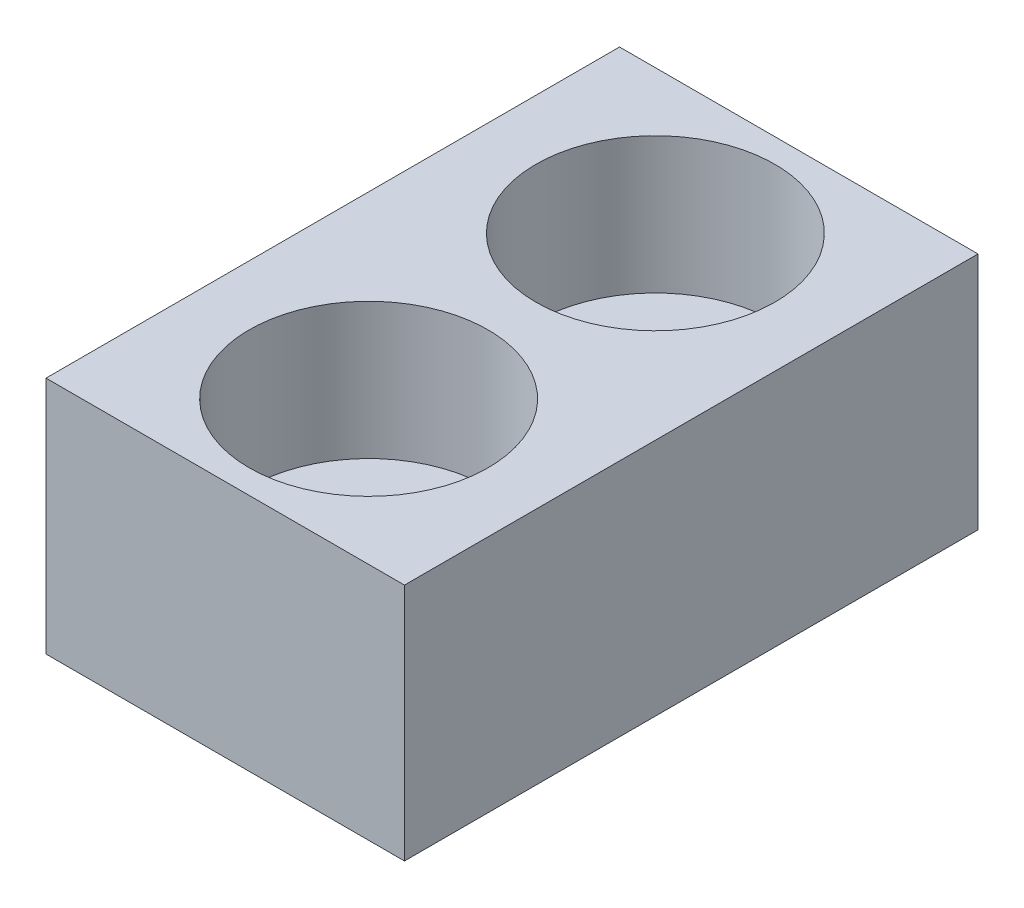
ISO-10303-21;
HEADER;
FILE_DESCRIPTION(('STEP AP214'),'2;1');
FILE_NAME('part.step','',(''),(''),'','','');
FILE_SCHEMA(('AUTOMOTIVE_DESIGN { 1 0 10303 214 1 1 1 1 }'));
ENDSEC;
DATA;
#1=APPLICATION_CONTEXT('core data for automotive mechanical design processes');
#2=APPLICATION_PROTOCOL_DEFINITION('international standard','automotive_design',2000,#1);
#3=PRODUCT_CONTEXT('',#1,'mechanical');
#4=PRODUCT('Part','Part','',(#3));
#5=PRODUCT_RELATED_PRODUCT_CATEGORY('part','',(#4));
#6=PRODUCT_DEFINITION_FORMATION('','',#4);
#7=PRODUCT_DEFINITION_CONTEXT('part definition',#1,'design');
#8=PRODUCT_DEFINITION('design','',#6,#7);
#9=PRODUCT_DEFINITION_SHAPE('','',#8);
#10=(LENGTH_UNIT() NAMED_UNIT(*) SI_UNIT(.MILLI.,.METRE.));
#11=(NAMED_UNIT(*) PLANE_ANGLE_UNIT() SI_UNIT($,.RADIAN.));
#12=(NAMED_UNIT(*) SI_UNIT($,.STERADIAN.) SOLID_ANGLE_UNIT());
#13=UNCERTAINTY_MEASURE_WITH_UNIT(LENGTH_MEASURE(1.E-05),#10,'distance_accuracy_value','');
#14=(GEOMETRIC_REPRESENTATION_CONTEXT(3) GLOBAL_UNCERTAINTY_ASSIGNED_CONTEXT((#13)) GLOBAL_UNIT_ASSIGNED_CONTEXT((#10,
#11,#12)) REPRESENTATION_CONTEXT('',''));
#15=CARTESIAN_POINT('',(0.,0.,0.));
#16=DIRECTION('',(0.,0.,1.));
#17=DIRECTION('',(1.,0.,0.));
#18=AXIS2_PLACEMENT_3D('',#15,#16,#17);
#19=CARTESIAN_POINT('',(-7.5,10.,12.));
#20=DIRECTION('',(1.,0.,0.));
#21=DIRECTION('',(0.,0.,-1.));
#22=AXIS2_PLACEMENT_3D('',#19,#20,#21);
#23=PLANE('',#22);
#24=DIRECTION('',(0.,0.,1.));
#25=VECTOR('',#24,1.);
#26=CARTESIAN_POINT('',(-7.5,0.,12.));
#27=LINE('',#26,#25);
#28=CARTESIAN_POINT('',(-7.5,0.,-12.));
#29=VERTEX_POINT('',#28);
#30=CARTESIAN_POINT('',(-7.5,0.,12.));
#31=VERTEX_POINT('',#30);
#32=EDGE_CURVE('E83',#29,#31,#27,.T.);
#33=ORIENTED_EDGE('',*,*,#32,.T.);
#34=DIRECTION('',(0.,-1.,0.));
#35=VECTOR('',#34,1.);
#36=CARTESIAN_POINT('',(-7.5,10.,12.));
#37=LINE('',#36,#35);
#38=CARTESIAN_POINT('',(-7.5,10.,12.));
#39=VERTEX_POINT('',#38);
#40=EDGE_CURVE('E11',#39,#31,#37,.T.);
#41=ORIENTED_EDGE('',*,*,#40,.F.);
#42=DIRECTION('',(0.,0.,1.));
#43=VECTOR('',#42,1.);
#44=CARTESIAN_POINT('',(-7.5,10.,12.));
#45=LINE('',#44,#43);
#46=CARTESIAN_POINT('',(-7.5,10.,-12.));
#47=VERTEX_POINT('',#46);
#48=EDGE_CURVE('E70',#47,#39,#45,.T.);
#49=ORIENTED_EDGE('',*,*,#48,.F.);
#50=DIRECTION('',(0.,-1.,0.));
#51=VECTOR('',#50,1.);
#52=CARTESIAN_POINT('',(-7.5,10.,-12.));
#53=LINE('',#52,#51);
#54=EDGE_CURVE('E79',#47,#29,#53,.T.);
#55=ORIENTED_EDGE('',*,*,#54,.T.);
#56=EDGE_LOOP('',(#33,#41,#49,#55));
#57=FACE_BOUND('',#56,.T.);
#58=ADVANCED_FACE('F17',(#57),#23,.F.);
#59=CARTESIAN_POINT('',(7.5,10.,12.));
#60=DIRECTION('',(0.,0.,-1.));
#61=DIRECTION('',(-1.,0.,0.));
#62=AXIS2_PLACEMENT_3D('',#59,#60,#61);
#63=PLANE('',#62);
#64=DIRECTION('',(1.,0.,0.));
#65=VECTOR('',#64,1.);
#66=CARTESIAN_POINT('',(7.5,0.,12.));
#67=LINE('',#66,#65);
#68=CARTESIAN_POINT('',(7.5,0.,12.));
#69=VERTEX_POINT('',#68);
#70=EDGE_CURVE('E74',#31,#69,#67,.T.);
#71=ORIENTED_EDGE('',*,*,#70,.T.);
#72=DIRECTION('',(0.,-1.,0.));
#73=VECTOR('',#72,1.);
#74=CARTESIAN_POINT('',(7.5,10.,12.));
#75=LINE('',#74,#73);
#76=CARTESIAN_POINT('',(7.5,10.,12.));
#77=VERTEX_POINT('',#76);
#78=EDGE_CURVE('E26',#77,#69,#75,.T.);
#79=ORIENTED_EDGE('',*,*,#78,.F.);
#80=DIRECTION('',(1.,0.,0.));
#81=VECTOR('',#80,1.);
#82=CARTESIAN_POINT('',(7.5,10.,12.));
#83=LINE('',#82,#81);
#84=EDGE_CURVE('E65',#39,#77,#83,.T.);
#85=ORIENTED_EDGE('',*,*,#84,.F.);
#86=ORIENTED_EDGE('',*,*,#40,.T.);
#87=EDGE_LOOP('',(#71,#79,#85,#86));
#88=FACE_BOUND('',#87,.T.);
#89=ADVANCED_FACE('F73',(#88),#63,.F.);
#90=CARTESIAN_POINT('',(7.5,10.,12.));
#91=DIRECTION('',(-1.,0.,0.));
#92=DIRECTION('',(0.,0.,1.));
#93=AXIS2_PLACEMENT_3D('',#90,#91,#92);
#94=PLANE('',#93);
#95=DIRECTION('',(0.,0.,-1.));
#96=VECTOR('',#95,1.);
#97=CARTESIAN_POINT('',(7.5,0.,12.));
#98=LINE('',#97,#96);
#99=CARTESIAN_POINT('',(7.5,0.,-12.));
#100=VERTEX_POINT('',#99);
#101=EDGE_CURVE('E52',#69,#100,#98,.T.);
#102=ORIENTED_EDGE('',*,*,#101,.T.);
#103=DIRECTION('',(0.,-1.,0.));
#104=VECTOR('',#103,1.);
#105=CARTESIAN_POINT('',(7.5,10.,-12.));
#106=LINE('',#105,#104);
#107=CARTESIAN_POINT('',(7.5,10.,-12.));
#108=VERTEX_POINT('',#107);
#109=EDGE_CURVE('E75',#108,#100,#106,.T.);
#110=ORIENTED_EDGE('',*,*,#109,.F.);
#111=DIRECTION('',(0.,0.,-1.));
#112=VECTOR('',#111,1.);
#113=CARTESIAN_POINT('',(7.5,10.,12.));
#114=LINE('',#113,#112);
#115=EDGE_CURVE('E68',#77,#108,#114,.T.);
#116=ORIENTED_EDGE('',*,*,#115,.F.);
#117=ORIENTED_EDGE('',*,*,#78,.T.);
#118=EDGE_LOOP('',(#102,#110,#116,#117));
#119=FACE_BOUND('',#118,.T.);
#120=ADVANCED_FACE('F77',(#119),#94,.F.);
#121=CARTESIAN_POINT('',(7.5,10.,-12.));
#122=DIRECTION('',(0.,0.,1.));
#123=DIRECTION('',(1.,0.,0.));
#124=AXIS2_PLACEMENT_3D('',#121,#122,#123);
#125=PLANE('',#124);
#126=DIRECTION('',(-1.,0.,0.));
#127=VECTOR('',#126,1.);
#128=CARTESIAN_POINT('',(7.5,0.,-12.));
#129=LINE('',#128,#127);
#130=EDGE_CURVE('E58',#100,#29,#129,.T.);
#131=ORIENTED_EDGE('',*,*,#130,.T.);
#132=ORIENTED_EDGE('',*,*,#54,.F.);
#133=DIRECTION('',(-1.,0.,0.));
#134=VECTOR('',#133,1.);
#135=CARTESIAN_POINT('',(7.5,10.,-12.));
#136=LINE('',#135,#134);
#137=EDGE_CURVE('E35',#108,#47,#136,.T.);
#138=ORIENTED_EDGE('',*,*,#137,.F.);
#139=ORIENTED_EDGE('',*,*,#109,.T.);
#140=EDGE_LOOP('',(#131,#132,#138,#139));
#141=FACE_BOUND('',#140,.T.);
#142=ADVANCED_FACE('F121',(#141),#125,.F.);
#143=CARTESIAN_POINT('',(0.,10.,0.));
#144=DIRECTION('',(0.,1.,0.));
#145=DIRECTION('',(0.,0.,1.));
#146=AXIS2_PLACEMENT_3D('',#143,#144,#145);
#147=PLANE('',#146);
#148=CARTESIAN_POINT('',(0.,10.,-6.));
#149=DIRECTION('',(0.,1.,0.));
#150=DIRECTION('',(0.,0.,1.));
#151=AXIS2_PLACEMENT_3D('',#148,#149,#150);
#152=CIRCLE('',#151,5.);
#153=CARTESIAN_POINT('',(0.,10.,-1.));
#154=VERTEX_POINT('',#153);
#155=EDGE_CURVE('E112',#154,#154,#152,.T.);
#156=ORIENTED_EDGE('',*,*,#155,.F.);
#157=EDGE_LOOP('',(#156));
#158=FACE_BOUND('',#157,.T.);
#159=CARTESIAN_POINT('',(0.,10.,6.));
#160=DIRECTION('',(0.,1.,0.));
#161=DIRECTION('',(0.,0.,1.));
#162=AXIS2_PLACEMENT_3D('',#159,#160,#161);
#163=CIRCLE('',#162,5.);
#164=CARTESIAN_POINT('',(0.,10.,11.));
#165=VERTEX_POINT('',#164);
#166=EDGE_CURVE('E101',#165,#165,#163,.T.);
#167=ORIENTED_EDGE('',*,*,#166,.F.);
#168=EDGE_LOOP('',(#167));
#169=FACE_BOUND('',#168,.T.);
#170=ORIENTED_EDGE('',*,*,#48,.T.);
#171=ORIENTED_EDGE('',*,*,#84,.T.);
#172=ORIENTED_EDGE('',*,*,#115,.T.);
#173=ORIENTED_EDGE('',*,*,#137,.T.);
#174=EDGE_LOOP('',(#170,#171,#172,#173));
#175=FACE_BOUND('',#174,.T.);
#176=ADVANCED_FACE('F66',(#158,#169,#175),#147,.T.);
#177=CARTESIAN_POINT('',(0.,0.,0.));
#178=DIRECTION('',(0.,1.,0.));
#179=DIRECTION('',(0.,0.,1.));
#180=AXIS2_PLACEMENT_3D('',#177,#178,#179);
#181=PLANE('',#180);
#182=CARTESIAN_POINT('',(0.,0.,-6.));
#183=DIRECTION('',(0.,1.,0.));
#184=DIRECTION('',(0.,0.,1.));
#185=AXIS2_PLACEMENT_3D('',#182,#183,#184);
#186=CIRCLE('',#185,2.75);
#187=CARTESIAN_POINT('',(0.,0.,-3.25));
#188=VERTEX_POINT('',#187);
#189=EDGE_CURVE('E20',#188,#188,#186,.T.);
#190=ORIENTED_EDGE('',*,*,#189,.T.);
#191=EDGE_LOOP('',(#190));
#192=FACE_BOUND('',#191,.T.);
#193=CARTESIAN_POINT('',(0.,0.,6.));
#194=DIRECTION('',(0.,1.,0.));
#195=DIRECTION('',(0.,0.,1.));
#196=AXIS2_PLACEMENT_3D('',#193,#194,#195);
#197=CIRCLE('',#196,2.75);
#198=CARTESIAN_POINT('',(0.,0.,8.75));
#199=VERTEX_POINT('',#198);
#200=EDGE_CURVE('E86',#199,#199,#197,.T.);
#201=ORIENTED_EDGE('',*,*,#200,.T.);
#202=EDGE_LOOP('',(#201));
#203=FACE_BOUND('',#202,.T.);
#204=ORIENTED_EDGE('',*,*,#32,.F.);
#205=ORIENTED_EDGE('',*,*,#130,.F.);
#206=ORIENTED_EDGE('',*,*,#101,.F.);
#207=ORIENTED_EDGE('',*,*,#70,.F.);
#208=EDGE_LOOP('',(#204,#205,#206,#207));
#209=FACE_BOUND('',#208,.T.);
#210=ADVANCED_FACE('F120',(#192,#203,#209),#181,.F.);
#211=CARTESIAN_POINT('',(0.,10.,6.));
#212=DIRECTION('',(0.,1.,0.));
#213=DIRECTION('',(0.,0.,1.));
#214=AXIS2_PLACEMENT_3D('',#211,#212,#213);
#215=CYLINDRICAL_SURFACE('',#214,2.75);
#216=CARTESIAN_POINT('',(0.,4.3,6.));
#217=DIRECTION('',(0.,1.,0.));
#218=DIRECTION('',(0.,0.,1.));
#219=AXIS2_PLACEMENT_3D('',#216,#217,#218);
#220=CIRCLE('',#219,2.75);
#221=CARTESIAN_POINT('',(0.,4.3,8.75));
#222=VERTEX_POINT('',#221);
#223=EDGE_CURVE('E92',#222,#222,#220,.T.);
#224=ORIENTED_EDGE('',*,*,#223,.T.);
#225=EDGE_LOOP('',(#224));
#226=FACE_BOUND('',#225,.T.);
#227=ORIENTED_EDGE('',*,*,#200,.F.);
#228=EDGE_LOOP('',(#227));
#229=FACE_BOUND('',#228,.T.);
#230=ADVANCED_FACE('F140',(#226,#229),#215,.F.);
#231=CARTESIAN_POINT('',(2.75,4.3,6.));
#232=DIRECTION('',(0.,-1.,0.));
#233=DIRECTION('',(0.,0.,-1.));
#234=AXIS2_PLACEMENT_3D('',#231,#232,#233);
#235=PLANE('',#234);
#236=ORIENTED_EDGE('',*,*,#223,.F.);
#237=EDGE_LOOP('',(#236));
#238=FACE_BOUND('',#237,.T.);
#239=CARTESIAN_POINT('',(0.,4.3,6.));
#240=DIRECTION('',(0.,1.,0.));
#241=DIRECTION('',(0.,0.,1.));
#242=AXIS2_PLACEMENT_3D('',#239,#240,#241);
#243=CIRCLE('',#242,5.);
#244=CARTESIAN_POINT('',(0.,4.3,11.));
#245=VERTEX_POINT('',#244);
#246=EDGE_CURVE('E96',#245,#245,#243,.T.);
#247=ORIENTED_EDGE('',*,*,#246,.T.);
#248=EDGE_LOOP('',(#247));
#249=FACE_BOUND('',#248,.T.);
#250=ADVANCED_FACE('F128',(#238,#249),#235,.F.);
#251=CARTESIAN_POINT('',(0.,10.,6.));
#252=DIRECTION('',(0.,1.,0.));
#253=DIRECTION('',(0.,0.,1.));
#254=AXIS2_PLACEMENT_3D('',#251,#252,#253);
#255=CYLINDRICAL_SURFACE('',#254,5.);
#256=ORIENTED_EDGE('',*,*,#246,.F.);
#257=EDGE_LOOP('',(#256));
#258=FACE_BOUND('',#257,.T.);
#259=ORIENTED_EDGE('',*,*,#166,.T.);
#260=EDGE_LOOP('',(#259));
#261=FACE_BOUND('',#260,.T.);
#262=ADVANCED_FACE('F125',(#258,#261),#255,.F.);
#263=CARTESIAN_POINT('',(0.,10.,-6.));
#264=DIRECTION('',(0.,1.,0.));
#265=DIRECTION('',(0.,0.,1.));
#266=AXIS2_PLACEMENT_3D('',#263,#264,#265);
#267=CYLINDRICAL_SURFACE('',#266,2.75);
#268=CARTESIAN_POINT('',(0.,4.3,-6.));
#269=DIRECTION('',(0.,1.,0.));
#270=DIRECTION('',(0.,0.,1.));
#271=AXIS2_PLACEMENT_3D('',#268,#269,#270);
#272=CIRCLE('',#271,2.75);
#273=CARTESIAN_POINT('',(0.,4.3,-3.25));
#274=VERTEX_POINT('',#273);
#275=EDGE_CURVE('E106',#274,#274,#272,.T.);
#276=ORIENTED_EDGE('',*,*,#275,.T.);
#277=EDGE_LOOP('',(#276));
#278=FACE_BOUND('',#277,.T.);
#279=ORIENTED_EDGE('',*,*,#189,.F.);
#280=EDGE_LOOP('',(#279));
#281=FACE_BOUND('',#280,.T.);
#282=ADVANCED_FACE('F127',(#278,#281),#267,.F.);
#283=CARTESIAN_POINT('',(2.75,4.3,-6.));
#284=DIRECTION('',(0.,-1.,0.));
#285=DIRECTION('',(0.,0.,-1.));
#286=AXIS2_PLACEMENT_3D('',#283,#284,#285);
#287=PLANE('',#286);
#288=ORIENTED_EDGE('',*,*,#275,.F.);
#289=EDGE_LOOP('',(#288));
#290=FACE_BOUND('',#289,.T.);
#291=CARTESIAN_POINT('',(0.,4.3,-6.));
#292=DIRECTION('',(0.,1.,0.));
#293=DIRECTION('',(0.,0.,1.));
#294=AXIS2_PLACEMENT_3D('',#291,#292,#293);
#295=CIRCLE('',#294,5.);
#296=CARTESIAN_POINT('',(0.,4.3,-1.));
#297=VERTEX_POINT('',#296);
#298=EDGE_CURVE('E109',#297,#297,#295,.T.);
#299=ORIENTED_EDGE('',*,*,#298,.T.);
#300=EDGE_LOOP('',(#299));
#301=FACE_BOUND('',#300,.T.);
#302=ADVANCED_FACE('F137',(#290,#301),#287,.F.);
#303=CARTESIAN_POINT('',(0.,10.,-6.));
#304=DIRECTION('',(0.,1.,0.));
#305=DIRECTION('',(0.,0.,1.));
#306=AXIS2_PLACEMENT_3D('',#303,#304,#305);
#307=CYLINDRICAL_SURFACE('',#306,5.);
#308=ORIENTED_EDGE('',*,*,#298,.F.);
#309=EDGE_LOOP('',(#308));
#310=FACE_BOUND('',#309,.T.);
#311=ORIENTED_EDGE('',*,*,#155,.T.);
#312=EDGE_LOOP('',(#311));
#313=FACE_BOUND('',#312,.T.);
#314=ADVANCED_FACE('F116',(#310,#313),#307,.F.);
#315=CLOSED_SHELL('',(#58,#89,#120,#142,#176,#210,#230,#250,#262,#282,#302,#314));
#316=MANIFOLD_SOLID_BREP('B1',#315);
#317=ADVANCED_BREP_SHAPE_REPRESENTATION('',(#18,#316),#14);
#318=SHAPE_DEFINITION_REPRESENTATION(#9,#317);
ENDSEC;
END-ISO-10303-21;
